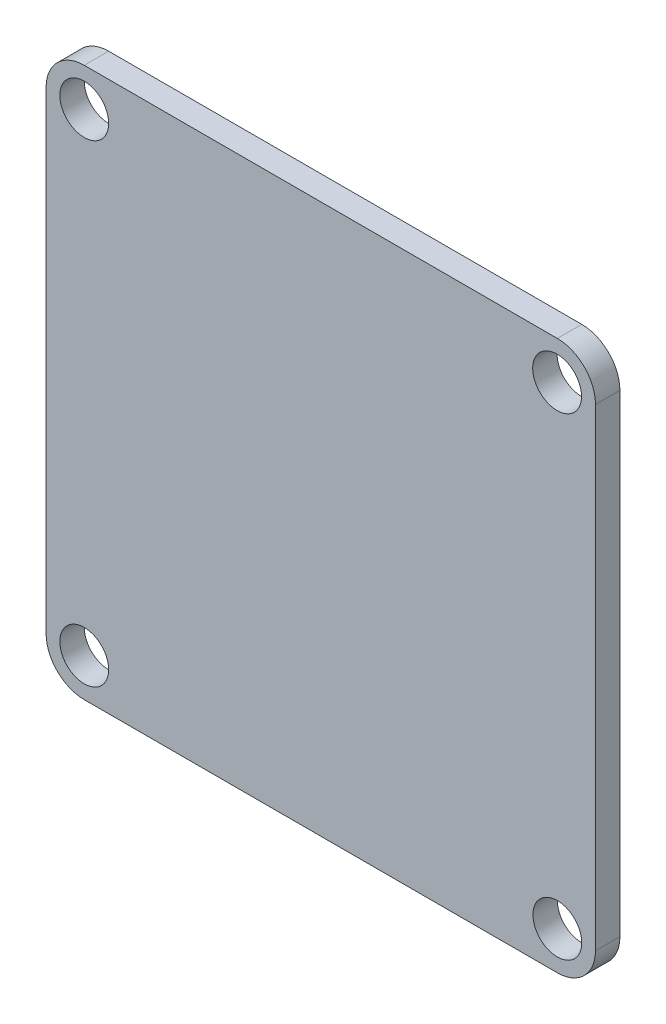
ISO-10303-21;
HEADER;
FILE_DESCRIPTION(('STEP AP214'),'2;1');
FILE_NAME('part.step','',(''),(''),'','','');
FILE_SCHEMA(('AUTOMOTIVE_DESIGN { 1 0 10303 214 1 1 1 1 }'));
ENDSEC;
DATA;
#1=APPLICATION_CONTEXT('core data for automotive mechanical design processes');
#2=APPLICATION_PROTOCOL_DEFINITION('international standard','automotive_design',2000,#1);
#3=PRODUCT_CONTEXT('',#1,'mechanical');
#4=PRODUCT('Part','Part','',(#3));
#5=PRODUCT_RELATED_PRODUCT_CATEGORY('part','',(#4));
#6=PRODUCT_DEFINITION_FORMATION('','',#4);
#7=PRODUCT_DEFINITION_CONTEXT('part definition',#1,'design');
#8=PRODUCT_DEFINITION('design','',#6,#7);
#9=PRODUCT_DEFINITION_SHAPE('','',#8);
#10=(LENGTH_UNIT() NAMED_UNIT(*) SI_UNIT(.MILLI.,.METRE.));
#11=(NAMED_UNIT(*) PLANE_ANGLE_UNIT() SI_UNIT($,.RADIAN.));
#12=(NAMED_UNIT(*) SI_UNIT($,.STERADIAN.) SOLID_ANGLE_UNIT());
#13=UNCERTAINTY_MEASURE_WITH_UNIT(LENGTH_MEASURE(1.E-05),#10,'distance_accuracy_value','');
#14=(GEOMETRIC_REPRESENTATION_CONTEXT(3) GLOBAL_UNCERTAINTY_ASSIGNED_CONTEXT((#13)) GLOBAL_UNIT_ASSIGNED_CONTEXT((#10,
#11,#12)) REPRESENTATION_CONTEXT('',''));
#15=CARTESIAN_POINT('',(0.,0.,0.));
#16=DIRECTION('',(0.,0.,1.));
#17=DIRECTION('',(1.,0.,0.));
#18=AXIS2_PLACEMENT_3D('',#15,#16,#17);
#19=CARTESIAN_POINT('',(-18.,18.,1.6));
#20=DIRECTION('',(1.,0.,0.));
#21=DIRECTION('',(0.,1.,0.));
#22=AXIS2_PLACEMENT_3D('',#19,#20,#21);
#23=PLANE('',#22);
#24=DIRECTION('',(0.,-1.,0.));
#25=VECTOR('',#24,1.);
#26=CARTESIAN_POINT('',(-18.,18.,0.));
#27=LINE('',#26,#25);
#28=CARTESIAN_POINT('',(-18.,15.5,0.));
#29=VERTEX_POINT('',#28);
#30=CARTESIAN_POINT('',(-18.,-15.5,0.));
#31=VERTEX_POINT('',#30);
#32=EDGE_CURVE('E156',#29,#31,#27,.T.);
#33=ORIENTED_EDGE('',*,*,#32,.T.);
#34=DIRECTION('',(0.,0.,-1.));
#35=VECTOR('',#34,1.);
#36=CARTESIAN_POINT('',(-18.,-15.5,1.6));
#37=LINE('',#36,#35);
#38=CARTESIAN_POINT('',(-18.,-15.5,1.6));
#39=VERTEX_POINT('',#38);
#40=EDGE_CURVE('E11',#31,#39,#37,.F.);
#41=ORIENTED_EDGE('',*,*,#40,.T.);
#42=DIRECTION('',(0.,-1.,0.));
#43=VECTOR('',#42,1.);
#44=CARTESIAN_POINT('',(-18.,18.,1.6));
#45=LINE('',#44,#43);
#46=CARTESIAN_POINT('',(-18.,15.5,1.6));
#47=VERTEX_POINT('',#46);
#48=EDGE_CURVE('E124',#47,#39,#45,.T.);
#49=ORIENTED_EDGE('',*,*,#48,.F.);
#50=DIRECTION('',(0.,0.,-1.));
#51=VECTOR('',#50,1.);
#52=CARTESIAN_POINT('',(-18.,15.5,1.6));
#53=LINE('',#52,#51);
#54=EDGE_CURVE('E40',#47,#29,#53,.T.);
#55=ORIENTED_EDGE('',*,*,#54,.T.);
#56=EDGE_LOOP('',(#33,#41,#49,#55));
#57=FACE_BOUND('',#56,.T.);
#58=ADVANCED_FACE('F32',(#57),#23,.F.);
#59=CARTESIAN_POINT('',(18.,-18.,1.6));
#60=DIRECTION('',(0.,1.,0.));
#61=DIRECTION('',(-1.,0.,0.));
#62=AXIS2_PLACEMENT_3D('',#59,#60,#61);
#63=PLANE('',#62);
#64=DIRECTION('',(1.,0.,0.));
#65=VECTOR('',#64,1.);
#66=CARTESIAN_POINT('',(18.,-18.,0.));
#67=LINE('',#66,#65);
#68=CARTESIAN_POINT('',(-15.5,-18.,0.));
#69=VERTEX_POINT('',#68);
#70=CARTESIAN_POINT('',(15.5,-18.,0.));
#71=VERTEX_POINT('',#70);
#72=EDGE_CURVE('E129',#69,#71,#67,.T.);
#73=ORIENTED_EDGE('',*,*,#72,.T.);
#74=DIRECTION('',(0.,0.,-1.));
#75=VECTOR('',#74,1.);
#76=CARTESIAN_POINT('',(15.5,-18.,1.6));
#77=LINE('',#76,#75);
#78=CARTESIAN_POINT('',(15.5,-18.,1.6));
#79=VERTEX_POINT('',#78);
#80=EDGE_CURVE('E47',#71,#79,#77,.F.);
#81=ORIENTED_EDGE('',*,*,#80,.T.);
#82=DIRECTION('',(1.,0.,0.));
#83=VECTOR('',#82,1.);
#84=CARTESIAN_POINT('',(18.,-18.,1.6));
#85=LINE('',#84,#83);
#86=CARTESIAN_POINT('',(-15.5,-18.,1.6));
#87=VERTEX_POINT('',#86);
#88=EDGE_CURVE('E127',#87,#79,#85,.T.);
#89=ORIENTED_EDGE('',*,*,#88,.F.);
#90=DIRECTION('',(0.,0.,-1.));
#91=VECTOR('',#90,1.);
#92=CARTESIAN_POINT('',(-15.5,-18.,1.6));
#93=LINE('',#92,#91);
#94=EDGE_CURVE('E148',#87,#69,#93,.T.);
#95=ORIENTED_EDGE('',*,*,#94,.T.);
#96=EDGE_LOOP('',(#73,#81,#89,#95));
#97=FACE_BOUND('',#96,.T.);
#98=ADVANCED_FACE('F208',(#97),#63,.F.);
#99=CARTESIAN_POINT('',(18.,18.,1.6));
#100=DIRECTION('',(-1.,0.,0.));
#101=DIRECTION('',(0.,0.,1.));
#102=AXIS2_PLACEMENT_3D('',#99,#100,#101);
#103=PLANE('',#102);
#104=DIRECTION('',(0.,1.,0.));
#105=VECTOR('',#104,1.);
#106=CARTESIAN_POINT('',(18.,18.,0.));
#107=LINE('',#106,#105);
#108=CARTESIAN_POINT('',(18.,-15.5,0.));
#109=VERTEX_POINT('',#108);
#110=CARTESIAN_POINT('',(18.,15.5,0.));
#111=VERTEX_POINT('',#110);
#112=EDGE_CURVE('E125',#109,#111,#107,.T.);
#113=ORIENTED_EDGE('',*,*,#112,.T.);
#114=DIRECTION('',(0.,0.,-1.));
#115=VECTOR('',#114,1.);
#116=CARTESIAN_POINT('',(18.,15.5,1.6));
#117=LINE('',#116,#115);
#118=CARTESIAN_POINT('',(18.,15.5,1.6));
#119=VERTEX_POINT('',#118);
#120=EDGE_CURVE('E103',#111,#119,#117,.F.);
#121=ORIENTED_EDGE('',*,*,#120,.T.);
#122=DIRECTION('',(0.,1.,0.));
#123=VECTOR('',#122,1.);
#124=CARTESIAN_POINT('',(18.,18.,1.6));
#125=LINE('',#124,#123);
#126=CARTESIAN_POINT('',(18.,-15.5,1.6));
#127=VERTEX_POINT('',#126);
#128=EDGE_CURVE('E168',#127,#119,#125,.T.);
#129=ORIENTED_EDGE('',*,*,#128,.F.);
#130=DIRECTION('',(0.,0.,-1.));
#131=VECTOR('',#130,1.);
#132=CARTESIAN_POINT('',(18.,-15.5,1.6));
#133=LINE('',#132,#131);
#134=EDGE_CURVE('E108',#127,#109,#133,.T.);
#135=ORIENTED_EDGE('',*,*,#134,.T.);
#136=EDGE_LOOP('',(#113,#121,#129,#135));
#137=FACE_BOUND('',#136,.T.);
#138=ADVANCED_FACE('F205',(#137),#103,.F.);
#139=CARTESIAN_POINT('',(18.,18.,1.6));
#140=DIRECTION('',(0.,-1.,0.));
#141=DIRECTION('',(1.,0.,0.));
#142=AXIS2_PLACEMENT_3D('',#139,#140,#141);
#143=PLANE('',#142);
#144=DIRECTION('',(-1.,0.,0.));
#145=VECTOR('',#144,1.);
#146=CARTESIAN_POINT('',(18.,18.,1.6));
#147=LINE('',#146,#145);
#148=CARTESIAN_POINT('',(15.5,18.,1.6));
#149=VERTEX_POINT('',#148);
#150=CARTESIAN_POINT('',(-15.5,18.,1.6));
#151=VERTEX_POINT('',#150);
#152=EDGE_CURVE('E118',#149,#151,#147,.T.);
#153=ORIENTED_EDGE('',*,*,#152,.F.);
#154=DIRECTION('',(0.,0.,-1.));
#155=VECTOR('',#154,1.);
#156=CARTESIAN_POINT('',(15.5,18.,1.6));
#157=LINE('',#156,#155);
#158=CARTESIAN_POINT('',(15.5,18.,0.));
#159=VERTEX_POINT('',#158);
#160=EDGE_CURVE('E102',#149,#159,#157,.T.);
#161=ORIENTED_EDGE('',*,*,#160,.T.);
#162=DIRECTION('',(-1.,0.,0.));
#163=VECTOR('',#162,1.);
#164=CARTESIAN_POINT('',(18.,18.,0.));
#165=LINE('',#164,#163);
#166=CARTESIAN_POINT('',(-15.5,18.,0.));
#167=VERTEX_POINT('',#166);
#168=EDGE_CURVE('E115',#159,#167,#165,.T.);
#169=ORIENTED_EDGE('',*,*,#168,.T.);
#170=DIRECTION('',(0.,0.,-1.));
#171=VECTOR('',#170,1.);
#172=CARTESIAN_POINT('',(-15.5,18.,1.6));
#173=LINE('',#172,#171);
#174=EDGE_CURVE('E120',#167,#151,#173,.F.);
#175=ORIENTED_EDGE('',*,*,#174,.T.);
#176=EDGE_LOOP('',(#153,#161,#169,#175));
#177=FACE_BOUND('',#176,.T.);
#178=ADVANCED_FACE('F114',(#177),#143,.F.);
#179=CARTESIAN_POINT('',(0.,0.,1.6));
#180=DIRECTION('',(0.,0.,-1.));
#181=DIRECTION('',(-1.,0.,0.));
#182=AXIS2_PLACEMENT_3D('',#179,#180,#181);
#183=PLANE('',#182);
#184=CARTESIAN_POINT('',(15.5,-15.5,1.6));
#185=DIRECTION('',(0.,0.,1.));
#186=DIRECTION('',(1.,0.,0.));
#187=AXIS2_PLACEMENT_3D('',#184,#185,#186);
#188=CIRCLE('',#187,1.6);
#189=CARTESIAN_POINT('',(17.1,-15.5,1.6));
#190=VERTEX_POINT('',#189);
#191=EDGE_CURVE('E178',#190,#190,#188,.T.);
#192=ORIENTED_EDGE('',*,*,#191,.F.);
#193=EDGE_LOOP('',(#192));
#194=FACE_BOUND('',#193,.T.);
#195=CARTESIAN_POINT('',(15.4852587395524,15.5,1.6));
#196=DIRECTION('',(0.,0.,1.));
#197=DIRECTION('',(1.,0.,0.));
#198=AXIS2_PLACEMENT_3D('',#195,#196,#197);
#199=CIRCLE('',#198,1.6);
#200=CARTESIAN_POINT('',(17.0852587395524,15.5,1.6));
#201=VERTEX_POINT('',#200);
#202=EDGE_CURVE('E184',#201,#201,#199,.T.);
#203=ORIENTED_EDGE('',*,*,#202,.F.);
#204=EDGE_LOOP('',(#203));
#205=FACE_BOUND('',#204,.T.);
#206=CARTESIAN_POINT('',(-15.5,15.5,1.6));
#207=DIRECTION('',(0.,0.,1.));
#208=DIRECTION('',(1.,0.,0.));
#209=AXIS2_PLACEMENT_3D('',#206,#207,#208);
#210=CIRCLE('',#209,1.6);
#211=CARTESIAN_POINT('',(-13.9,15.5,1.6));
#212=VERTEX_POINT('',#211);
#213=EDGE_CURVE('E173',#212,#212,#210,.T.);
#214=ORIENTED_EDGE('',*,*,#213,.F.);
#215=EDGE_LOOP('',(#214));
#216=FACE_BOUND('',#215,.T.);
#217=CARTESIAN_POINT('',(-15.5,-15.5,1.6));
#218=DIRECTION('',(0.,0.,1.));
#219=DIRECTION('',(1.,0.,0.));
#220=AXIS2_PLACEMENT_3D('',#217,#218,#219);
#221=CIRCLE('',#220,1.6);
#222=CARTESIAN_POINT('',(-13.9,-15.5,1.6));
#223=VERTEX_POINT('',#222);
#224=EDGE_CURVE('E161',#223,#223,#221,.T.);
#225=ORIENTED_EDGE('',*,*,#224,.F.);
#226=EDGE_LOOP('',(#225));
#227=FACE_BOUND('',#226,.T.);
#228=ORIENTED_EDGE('',*,*,#128,.T.);
#229=CARTESIAN_POINT('',(15.5,15.5,1.6));
#230=DIRECTION('',(0.,0.,-1.));
#231=DIRECTION('',(-1.,0.,0.));
#232=AXIS2_PLACEMENT_3D('',#229,#230,#231);
#233=CIRCLE('',#232,2.5);
#234=EDGE_CURVE('E146',#119,#149,#233,.F.);
#235=ORIENTED_EDGE('',*,*,#234,.T.);
#236=ORIENTED_EDGE('',*,*,#152,.T.);
#237=CARTESIAN_POINT('',(-15.5,15.5,1.6));
#238=DIRECTION('',(0.,0.,-1.));
#239=DIRECTION('',(-1.,0.,0.));
#240=AXIS2_PLACEMENT_3D('',#237,#238,#239);
#241=CIRCLE('',#240,2.5);
#242=EDGE_CURVE('E141',#151,#47,#241,.F.);
#243=ORIENTED_EDGE('',*,*,#242,.T.);
#244=ORIENTED_EDGE('',*,*,#48,.T.);
#245=CARTESIAN_POINT('',(-15.5,-15.5,1.6));
#246=DIRECTION('',(0.,0.,-1.));
#247=DIRECTION('',(-1.,0.,0.));
#248=AXIS2_PLACEMENT_3D('',#245,#246,#247);
#249=CIRCLE('',#248,2.5);
#250=EDGE_CURVE('E54',#39,#87,#249,.F.);
#251=ORIENTED_EDGE('',*,*,#250,.T.);
#252=ORIENTED_EDGE('',*,*,#88,.T.);
#253=CARTESIAN_POINT('',(15.5,-15.5,1.6));
#254=DIRECTION('',(0.,0.,-1.));
#255=DIRECTION('',(-1.,0.,0.));
#256=AXIS2_PLACEMENT_3D('',#253,#254,#255);
#257=CIRCLE('',#256,2.5);
#258=EDGE_CURVE('E144',#79,#127,#257,.F.);
#259=ORIENTED_EDGE('',*,*,#258,.T.);
#260=EDGE_LOOP('',(#228,#235,#236,#243,#244,#251,#252,#259));
#261=FACE_BOUND('',#260,.T.);
#262=ADVANCED_FACE('F195',(#194,#205,#216,#227,#261),#183,.F.);
#263=CARTESIAN_POINT('',(0.,0.,0.));
#264=DIRECTION('',(0.,0.,-1.));
#265=DIRECTION('',(-1.,0.,0.));
#266=AXIS2_PLACEMENT_3D('',#263,#264,#265);
#267=PLANE('',#266);
#268=CARTESIAN_POINT('',(15.5,-15.5,0.));
#269=DIRECTION('',(0.,0.,-1.));
#270=DIRECTION('',(-1.,0.,0.));
#271=AXIS2_PLACEMENT_3D('',#268,#269,#270);
#272=CIRCLE('',#271,1.6);
#273=CARTESIAN_POINT('',(13.9,-15.5,0.));
#274=VERTEX_POINT('',#273);
#275=EDGE_CURVE('E175',#274,#274,#272,.F.);
#276=ORIENTED_EDGE('',*,*,#275,.T.);
#277=EDGE_LOOP('',(#276));
#278=FACE_BOUND('',#277,.T.);
#279=CARTESIAN_POINT('',(15.4852587395524,15.5,0.));
#280=DIRECTION('',(0.,0.,-1.));
#281=DIRECTION('',(-1.,0.,0.));
#282=AXIS2_PLACEMENT_3D('',#279,#280,#281);
#283=CIRCLE('',#282,1.6);
#284=CARTESIAN_POINT('',(13.8852587395524,15.5,0.));
#285=VERTEX_POINT('',#284);
#286=EDGE_CURVE('E181',#285,#285,#283,.F.);
#287=ORIENTED_EDGE('',*,*,#286,.T.);
#288=EDGE_LOOP('',(#287));
#289=FACE_BOUND('',#288,.T.);
#290=CARTESIAN_POINT('',(-15.5,15.5,0.));
#291=DIRECTION('',(0.,0.,-1.));
#292=DIRECTION('',(-1.,0.,0.));
#293=AXIS2_PLACEMENT_3D('',#290,#291,#292);
#294=CIRCLE('',#293,1.6);
#295=CARTESIAN_POINT('',(-17.1,15.5,0.));
#296=VERTEX_POINT('',#295);
#297=EDGE_CURVE('E187',#296,#296,#294,.F.);
#298=ORIENTED_EDGE('',*,*,#297,.T.);
#299=EDGE_LOOP('',(#298));
#300=FACE_BOUND('',#299,.T.);
#301=CARTESIAN_POINT('',(-15.5,-15.5,0.));
#302=DIRECTION('',(0.,0.,-1.));
#303=DIRECTION('',(-1.,0.,0.));
#304=AXIS2_PLACEMENT_3D('',#301,#302,#303);
#305=CIRCLE('',#304,1.6);
#306=CARTESIAN_POINT('',(-17.1,-15.5,0.));
#307=VERTEX_POINT('',#306);
#308=EDGE_CURVE('E164',#307,#307,#305,.F.);
#309=ORIENTED_EDGE('',*,*,#308,.T.);
#310=EDGE_LOOP('',(#309));
#311=FACE_BOUND('',#310,.T.);
#312=ORIENTED_EDGE('',*,*,#168,.F.);
#313=CARTESIAN_POINT('',(15.5,15.5,0.));
#314=DIRECTION('',(0.,0.,-1.));
#315=DIRECTION('',(-1.,0.,0.));
#316=AXIS2_PLACEMENT_3D('',#313,#314,#315);
#317=CIRCLE('',#316,2.5);
#318=EDGE_CURVE('E98',#159,#111,#317,.T.);
#319=ORIENTED_EDGE('',*,*,#318,.T.);
#320=ORIENTED_EDGE('',*,*,#112,.F.);
#321=CARTESIAN_POINT('',(15.5,-15.5,0.));
#322=DIRECTION('',(0.,0.,-1.));
#323=DIRECTION('',(-1.,0.,0.));
#324=AXIS2_PLACEMENT_3D('',#321,#322,#323);
#325=CIRCLE('',#324,2.5);
#326=EDGE_CURVE('E109',#109,#71,#325,.T.);
#327=ORIENTED_EDGE('',*,*,#326,.T.);
#328=ORIENTED_EDGE('',*,*,#72,.F.);
#329=CARTESIAN_POINT('',(-15.5,-15.5,0.));
#330=DIRECTION('',(0.,0.,-1.));
#331=DIRECTION('',(-1.,0.,0.));
#332=AXIS2_PLACEMENT_3D('',#329,#330,#331);
#333=CIRCLE('',#332,2.5);
#334=EDGE_CURVE('E135',#69,#31,#333,.T.);
#335=ORIENTED_EDGE('',*,*,#334,.T.);
#336=ORIENTED_EDGE('',*,*,#32,.F.);
#337=CARTESIAN_POINT('',(-15.5,15.5,0.));
#338=DIRECTION('',(0.,0.,-1.));
#339=DIRECTION('',(-1.,0.,0.));
#340=AXIS2_PLACEMENT_3D('',#337,#338,#339);
#341=CIRCLE('',#340,2.5);
#342=EDGE_CURVE('E119',#29,#167,#341,.T.);
#343=ORIENTED_EDGE('',*,*,#342,.T.);
#344=EDGE_LOOP('',(#312,#319,#320,#327,#328,#335,#336,#343));
#345=FACE_BOUND('',#344,.T.);
#346=ADVANCED_FACE('F122',(#278,#289,#300,#311,#345),#267,.T.);
#347=CARTESIAN_POINT('',(15.5,15.5,1.6));
#348=DIRECTION('',(0.,0.,-1.));
#349=DIRECTION('',(-1.,0.,0.));
#350=AXIS2_PLACEMENT_3D('',#347,#348,#349);
#351=CYLINDRICAL_SURFACE('',#350,2.5);
#352=ORIENTED_EDGE('',*,*,#234,.F.);
#353=ORIENTED_EDGE('',*,*,#120,.F.);
#354=ORIENTED_EDGE('',*,*,#318,.F.);
#355=ORIENTED_EDGE('',*,*,#160,.F.);
#356=EDGE_LOOP('',(#352,#353,#354,#355));
#357=FACE_BOUND('',#356,.T.);
#358=ADVANCED_FACE('F101',(#357),#351,.T.);
#359=CARTESIAN_POINT('',(15.5,-15.5,1.6));
#360=DIRECTION('',(0.,0.,-1.));
#361=DIRECTION('',(-1.,0.,0.));
#362=AXIS2_PLACEMENT_3D('',#359,#360,#361);
#363=CYLINDRICAL_SURFACE('',#362,2.5);
#364=ORIENTED_EDGE('',*,*,#258,.F.);
#365=ORIENTED_EDGE('',*,*,#80,.F.);
#366=ORIENTED_EDGE('',*,*,#326,.F.);
#367=ORIENTED_EDGE('',*,*,#134,.F.);
#368=EDGE_LOOP('',(#364,#365,#366,#367));
#369=FACE_BOUND('',#368,.T.);
#370=ADVANCED_FACE('F207',(#369),#363,.T.);
#371=CARTESIAN_POINT('',(-15.5,-15.5,1.6));
#372=DIRECTION('',(0.,0.,-1.));
#373=DIRECTION('',(-1.,0.,0.));
#374=AXIS2_PLACEMENT_3D('',#371,#372,#373);
#375=CYLINDRICAL_SURFACE('',#374,2.5);
#376=ORIENTED_EDGE('',*,*,#250,.F.);
#377=ORIENTED_EDGE('',*,*,#40,.F.);
#378=ORIENTED_EDGE('',*,*,#334,.F.);
#379=ORIENTED_EDGE('',*,*,#94,.F.);
#380=EDGE_LOOP('',(#376,#377,#378,#379));
#381=FACE_BOUND('',#380,.T.);
#382=ADVANCED_FACE('F211',(#381),#375,.T.);
#383=CARTESIAN_POINT('',(-15.5,15.5,1.6));
#384=DIRECTION('',(0.,0.,-1.));
#385=DIRECTION('',(-1.,0.,0.));
#386=AXIS2_PLACEMENT_3D('',#383,#384,#385);
#387=CYLINDRICAL_SURFACE('',#386,2.5);
#388=ORIENTED_EDGE('',*,*,#242,.F.);
#389=ORIENTED_EDGE('',*,*,#174,.F.);
#390=ORIENTED_EDGE('',*,*,#342,.F.);
#391=ORIENTED_EDGE('',*,*,#54,.F.);
#392=EDGE_LOOP('',(#388,#389,#390,#391));
#393=FACE_BOUND('',#392,.T.);
#394=ADVANCED_FACE('F34',(#393),#387,.T.);
#395=CARTESIAN_POINT('',(-15.5,-15.5,-0.000999999999999916));
#396=DIRECTION('',(0.,0.,1.));
#397=DIRECTION('',(1.,0.,0.));
#398=AXIS2_PLACEMENT_3D('',#395,#396,#397);
#399=CYLINDRICAL_SURFACE('',#398,1.6);
#400=ORIENTED_EDGE('',*,*,#308,.F.);
#401=EDGE_LOOP('',(#400));
#402=FACE_BOUND('',#401,.T.);
#403=ORIENTED_EDGE('',*,*,#224,.T.);
#404=EDGE_LOOP('',(#403));
#405=FACE_BOUND('',#404,.T.);
#406=ADVANCED_FACE('F213',(#402,#405),#399,.F.);
#407=CARTESIAN_POINT('',(-15.5,15.5,-0.000999999999999916));
#408=DIRECTION('',(0.,0.,1.));
#409=DIRECTION('',(1.,0.,0.));
#410=AXIS2_PLACEMENT_3D('',#407,#408,#409);
#411=CYLINDRICAL_SURFACE('',#410,1.6);
#412=ORIENTED_EDGE('',*,*,#297,.F.);
#413=EDGE_LOOP('',(#412));
#414=FACE_BOUND('',#413,.T.);
#415=ORIENTED_EDGE('',*,*,#213,.T.);
#416=EDGE_LOOP('',(#415));
#417=FACE_BOUND('',#416,.T.);
#418=ADVANCED_FACE('F193',(#414,#417),#411,.F.);
#419=CARTESIAN_POINT('',(15.4852587395524,15.5,-0.000999999999999916));
#420=DIRECTION('',(0.,0.,1.));
#421=DIRECTION('',(1.,0.,0.));
#422=AXIS2_PLACEMENT_3D('',#419,#420,#421);
#423=CYLINDRICAL_SURFACE('',#422,1.6);
#424=ORIENTED_EDGE('',*,*,#286,.F.);
#425=EDGE_LOOP('',(#424));
#426=FACE_BOUND('',#425,.T.);
#427=ORIENTED_EDGE('',*,*,#202,.T.);
#428=EDGE_LOOP('',(#427));
#429=FACE_BOUND('',#428,.T.);
#430=ADVANCED_FACE('F276',(#426,#429),#423,.F.);
#431=CARTESIAN_POINT('',(15.5,-15.5,-0.000999999999999916));
#432=DIRECTION('',(0.,0.,1.));
#433=DIRECTION('',(1.,0.,0.));
#434=AXIS2_PLACEMENT_3D('',#431,#432,#433);
#435=CYLINDRICAL_SURFACE('',#434,1.6);
#436=ORIENTED_EDGE('',*,*,#275,.F.);
#437=EDGE_LOOP('',(#436));
#438=FACE_BOUND('',#437,.T.);
#439=ORIENTED_EDGE('',*,*,#191,.T.);
#440=EDGE_LOOP('',(#439));
#441=FACE_BOUND('',#440,.T.);
#442=ADVANCED_FACE('F286',(#438,#441),#435,.F.);
#443=CLOSED_SHELL('',(#58,#98,#138,#178,#262,#346,#358,#370,#382,#394,#406,#418,#430,#442));
#444=MANIFOLD_SOLID_BREP('B2',#443);
#445=ADVANCED_BREP_SHAPE_REPRESENTATION('',(#18,#444),#14);
#446=SHAPE_DEFINITION_REPRESENTATION(#9,#445);
ENDSEC;
END-ISO-10303-21;
